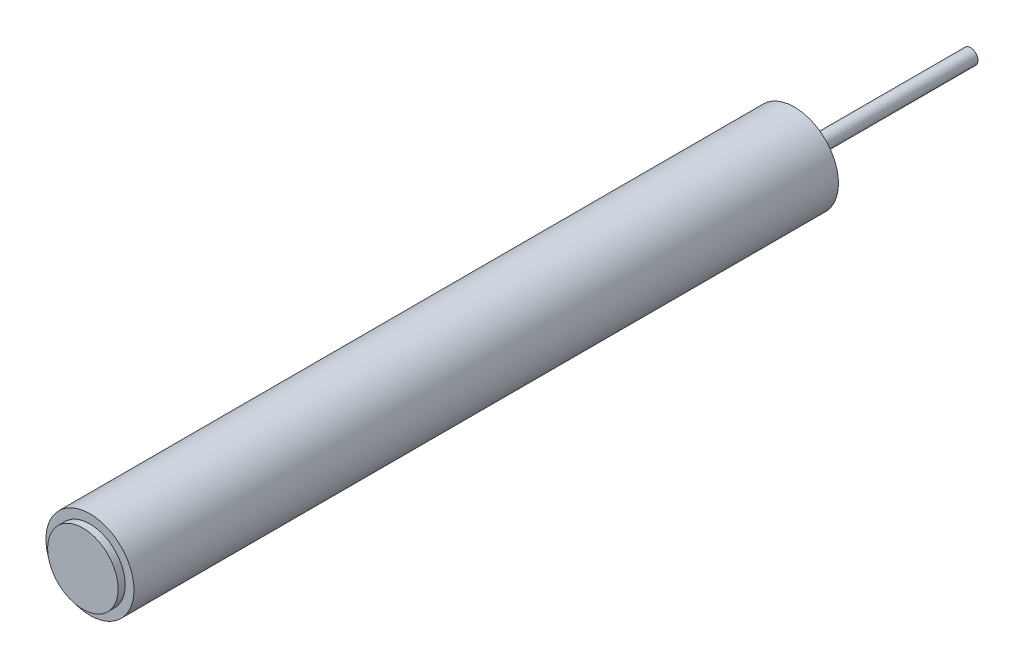
ISO-10303-21;
HEADER;
FILE_DESCRIPTION(('STEP AP214'),'2;1');
FILE_NAME('part.step','',(''),(''),'','','');
FILE_SCHEMA(('AUTOMOTIVE_DESIGN { 1 0 10303 214 1 1 1 1 }'));
ENDSEC;
DATA;
#1=APPLICATION_CONTEXT('core data for automotive mechanical design processes');
#2=APPLICATION_PROTOCOL_DEFINITION('international standard','automotive_design',2000,#1);
#3=PRODUCT_CONTEXT('',#1,'mechanical');
#4=PRODUCT('Part','Part','',(#3));
#5=PRODUCT_RELATED_PRODUCT_CATEGORY('part','',(#4));
#6=PRODUCT_DEFINITION_FORMATION('','',#4);
#7=PRODUCT_DEFINITION_CONTEXT('part definition',#1,'design');
#8=PRODUCT_DEFINITION('design','',#6,#7);
#9=PRODUCT_DEFINITION_SHAPE('','',#8);
#10=(LENGTH_UNIT() NAMED_UNIT(*) SI_UNIT(.MILLI.,.METRE.));
#11=(NAMED_UNIT(*) PLANE_ANGLE_UNIT() SI_UNIT($,.RADIAN.));
#12=(NAMED_UNIT(*) SI_UNIT($,.STERADIAN.) SOLID_ANGLE_UNIT());
#13=UNCERTAINTY_MEASURE_WITH_UNIT(LENGTH_MEASURE(1.E-05),#10,'distance_accuracy_value','');
#14=(GEOMETRIC_REPRESENTATION_CONTEXT(3) GLOBAL_UNCERTAINTY_ASSIGNED_CONTEXT((#13)) GLOBAL_UNIT_ASSIGNED_CONTEXT((#10,
#11,#12)) REPRESENTATION_CONTEXT('',''));
#15=CARTESIAN_POINT('',(0.,0.,0.));
#16=DIRECTION('',(0.,0.,1.));
#17=DIRECTION('',(1.,0.,0.));
#18=AXIS2_PLACEMENT_3D('',#15,#16,#17);
#19=CARTESIAN_POINT('',(0.,0.,50.8));
#20=DIRECTION('',(0.,0.,-1.));
#21=DIRECTION('',(-1.,0.,0.));
#22=AXIS2_PLACEMENT_3D('',#19,#20,#21);
#23=CYLINDRICAL_SURFACE('',#22,2.54);
#24=CARTESIAN_POINT('',(0.,0.,0.));
#25=DIRECTION('',(0.,0.,1.));
#26=DIRECTION('',(1.,0.,0.));
#27=AXIS2_PLACEMENT_3D('',#24,#25,#26);
#28=CIRCLE('',#27,2.54);
#29=CARTESIAN_POINT('',(2.54,0.,0.));
#30=VERTEX_POINT('',#29);
#31=EDGE_CURVE('E43',#30,#30,#28,.T.);
#32=ORIENTED_EDGE('',*,*,#31,.F.);
#33=EDGE_LOOP('',(#32));
#34=FACE_BOUND('',#33,.T.);
#35=CARTESIAN_POINT('',(0.,0.,48.26));
#36=DIRECTION('',(0.,0.,1.));
#37=DIRECTION('',(1.,0.,0.));
#38=AXIS2_PLACEMENT_3D('',#35,#36,#37);
#39=CIRCLE('',#38,2.54);
#40=CARTESIAN_POINT('',(2.54,0.,48.26));
#41=VERTEX_POINT('',#40);
#42=EDGE_CURVE('E51',#41,#41,#39,.T.);
#43=ORIENTED_EDGE('',*,*,#42,.T.);
#44=EDGE_LOOP('',(#43));
#45=FACE_BOUND('',#44,.T.);
#46=ADVANCED_FACE('F30',(#34,#45),#23,.F.);
#47=CARTESIAN_POINT('',(0.,0.,50.8));
#48=DIRECTION('',(0.,0.,1.));
#49=DIRECTION('',(1.,0.,0.));
#50=AXIS2_PLACEMENT_3D('',#47,#48,#49);
#51=PLANE('',#50);
#52=CARTESIAN_POINT('',(0.,0.,50.8));
#53=DIRECTION('',(0.,0.,1.));
#54=DIRECTION('',(1.,0.,0.));
#55=AXIS2_PLACEMENT_3D('',#52,#53,#54);
#56=CIRCLE('',#55,3.175);
#57=CARTESIAN_POINT('',(3.175,0.,50.8));
#58=VERTEX_POINT('',#57);
#59=EDGE_CURVE('E10',#58,#58,#56,.T.);
#60=ORIENTED_EDGE('',*,*,#59,.T.);
#61=EDGE_LOOP('',(#60));
#62=FACE_BOUND('',#61,.T.);
#63=CARTESIAN_POINT('',(0.,0.,50.8));
#64=DIRECTION('',(0.,0.,1.));
#65=DIRECTION('',(1.,0.,0.));
#66=AXIS2_PLACEMENT_3D('',#63,#64,#65);
#67=CIRCLE('',#66,2.54);
#68=CARTESIAN_POINT('',(2.54,0.,50.8));
#69=VERTEX_POINT('',#68);
#70=EDGE_CURVE('E41',#69,#69,#67,.T.);
#71=ORIENTED_EDGE('',*,*,#70,.F.);
#72=EDGE_LOOP('',(#71));
#73=FACE_BOUND('',#72,.T.);
#74=ADVANCED_FACE('F73',(#62,#73),#51,.T.);
#75=CARTESIAN_POINT('',(0.,0.,0.));
#76=DIRECTION('',(0.,0.,1.));
#77=DIRECTION('',(1.,0.,0.));
#78=AXIS2_PLACEMENT_3D('',#75,#76,#77);
#79=PLANE('',#78);
#80=CARTESIAN_POINT('',(0.,0.,0.));
#81=DIRECTION('',(0.,0.,1.));
#82=DIRECTION('',(1.,0.,0.));
#83=AXIS2_PLACEMENT_3D('',#80,#81,#82);
#84=CIRCLE('',#83,3.175);
#85=CARTESIAN_POINT('',(3.175,0.,0.));
#86=VERTEX_POINT('',#85);
#87=EDGE_CURVE('E34',#86,#86,#84,.T.);
#88=ORIENTED_EDGE('',*,*,#87,.F.);
#89=EDGE_LOOP('',(#88));
#90=FACE_BOUND('',#89,.T.);
#91=ORIENTED_EDGE('',*,*,#31,.T.);
#92=EDGE_LOOP('',(#91));
#93=FACE_BOUND('',#92,.T.);
#94=ADVANCED_FACE('F79',(#90,#93),#79,.F.);
#95=CARTESIAN_POINT('',(0.,0.,50.8));
#96=DIRECTION('',(0.,0.,-1.));
#97=DIRECTION('',(-1.,0.,0.));
#98=AXIS2_PLACEMENT_3D('',#95,#96,#97);
#99=CYLINDRICAL_SURFACE('',#98,3.175);
#100=ORIENTED_EDGE('',*,*,#59,.F.);
#101=EDGE_LOOP('',(#100));
#102=FACE_BOUND('',#101,.T.);
#103=ORIENTED_EDGE('',*,*,#87,.T.);
#104=EDGE_LOOP('',(#103));
#105=FACE_BOUND('',#104,.T.);
#106=ADVANCED_FACE('F32',(#102,#105),#99,.T.);
#107=CARTESIAN_POINT('',(0.,0.,48.26));
#108=DIRECTION('',(0.,0.,1.));
#109=DIRECTION('',(1.,0.,0.));
#110=AXIS2_PLACEMENT_3D('',#107,#108,#109);
#111=PLANE('',#110);
#112=CARTESIAN_POINT('',(0.,0.,48.26));
#113=DIRECTION('',(0.,0.,1.));
#114=DIRECTION('',(1.,0.,0.));
#115=AXIS2_PLACEMENT_3D('',#112,#113,#114);
#116=CIRCLE('',#115,0.537131421966155);
#117=CARTESIAN_POINT('',(0.537131421966155,0.,48.26));
#118=VERTEX_POINT('',#117);
#119=EDGE_CURVE('E55',#118,#118,#116,.T.);
#120=ORIENTED_EDGE('',*,*,#119,.T.);
#121=EDGE_LOOP('',(#120));
#122=FACE_BOUND('',#121,.T.);
#123=ORIENTED_EDGE('',*,*,#42,.F.);
#124=EDGE_LOOP('',(#123));
#125=FACE_BOUND('',#124,.T.);
#126=ADVANCED_FACE('F91',(#122,#125),#111,.F.);
#127=CARTESIAN_POINT('',(0.,0.,51.308));
#128=DIRECTION('',(0.,0.,-1.));
#129=DIRECTION('',(-1.,0.,0.));
#130=AXIS2_PLACEMENT_3D('',#127,#128,#129);
#131=CYLINDRICAL_SURFACE('',#130,2.54);
#132=ORIENTED_EDGE('',*,*,#70,.T.);
#133=EDGE_LOOP('',(#132));
#134=FACE_BOUND('',#133,.T.);
#135=CARTESIAN_POINT('',(0.,0.,51.308));
#136=DIRECTION('',(0.,0.,1.));
#137=DIRECTION('',(1.,0.,0.));
#138=AXIS2_PLACEMENT_3D('',#135,#136,#137);
#139=CIRCLE('',#138,2.54);
#140=CARTESIAN_POINT('',(2.54,0.,51.308));
#141=VERTEX_POINT('',#140);
#142=EDGE_CURVE('E46',#141,#141,#139,.T.);
#143=ORIENTED_EDGE('',*,*,#142,.F.);
#144=EDGE_LOOP('',(#143));
#145=FACE_BOUND('',#144,.T.);
#146=ADVANCED_FACE('F84',(#134,#145),#131,.T.);
#147=CARTESIAN_POINT('',(0.,0.,51.308));
#148=DIRECTION('',(0.,0.,1.));
#149=DIRECTION('',(1.,0.,0.));
#150=AXIS2_PLACEMENT_3D('',#147,#148,#149);
#151=PLANE('',#150);
#152=ORIENTED_EDGE('',*,*,#142,.T.);
#153=EDGE_LOOP('',(#152));
#154=FACE_BOUND('',#153,.T.);
#155=ADVANCED_FACE('F70',(#154),#151,.T.);
#156=CARTESIAN_POINT('',(0.,0.,-12.7));
#157=DIRECTION('',(0.,0.,1.));
#158=DIRECTION('',(1.,0.,0.));
#159=AXIS2_PLACEMENT_3D('',#156,#157,#158);
#160=CYLINDRICAL_SURFACE('',#159,0.537131421966155);
#161=CARTESIAN_POINT('',(0.,0.,-12.7));
#162=DIRECTION('',(0.,0.,1.));
#163=DIRECTION('',(1.,0.,0.));
#164=AXIS2_PLACEMENT_3D('',#161,#162,#163);
#165=CIRCLE('',#164,0.537131421966155);
#166=CARTESIAN_POINT('',(0.537131421966155,0.,-12.7));
#167=VERTEX_POINT('',#166);
#168=EDGE_CURVE('E54',#167,#167,#165,.T.);
#169=ORIENTED_EDGE('',*,*,#168,.T.);
#170=EDGE_LOOP('',(#169));
#171=FACE_BOUND('',#170,.T.);
#172=ORIENTED_EDGE('',*,*,#119,.F.);
#173=EDGE_LOOP('',(#172));
#174=FACE_BOUND('',#173,.T.);
#175=ADVANCED_FACE('F61',(#171,#174),#160,.T.);
#176=CARTESIAN_POINT('',(0.,0.,-12.7));
#177=DIRECTION('',(0.,0.,1.));
#178=DIRECTION('',(1.,0.,0.));
#179=AXIS2_PLACEMENT_3D('',#176,#177,#178);
#180=PLANE('',#179);
#181=ORIENTED_EDGE('',*,*,#168,.F.);
#182=EDGE_LOOP('',(#181));
#183=FACE_BOUND('',#182,.T.);
#184=ADVANCED_FACE('F64',(#183),#180,.F.);
#185=CLOSED_SHELL('',(#46,#74,#94,#106,#126,#146,#155,#175,#184));
#186=MANIFOLD_SOLID_BREP('B2',#185);
#187=ADVANCED_BREP_SHAPE_REPRESENTATION('',(#18,#186),#14);
#188=SHAPE_DEFINITION_REPRESENTATION(#9,#187);
ENDSEC;
END-ISO-10303-21;
